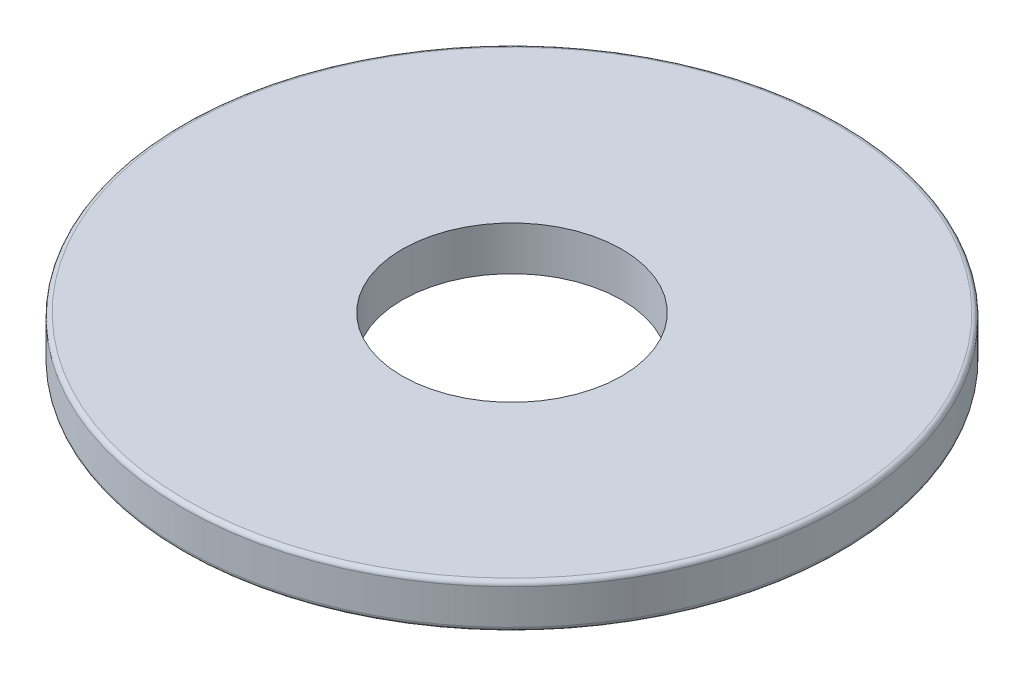
ISO-10303-21;
HEADER;
FILE_DESCRIPTION(('STEP AP214'),'2;1');
FILE_NAME('part.step','',(''),(''),'','','');
FILE_SCHEMA(('AUTOMOTIVE_DESIGN { 1 0 10303 214 1 1 1 1 }'));
ENDSEC;
DATA;
#1=APPLICATION_CONTEXT('core data for automotive mechanical design processes');
#2=APPLICATION_PROTOCOL_DEFINITION('international standard','automotive_design',2000,#1);
#3=PRODUCT_CONTEXT('',#1,'mechanical');
#4=PRODUCT('Part','Part','',(#3));
#5=PRODUCT_RELATED_PRODUCT_CATEGORY('part','',(#4));
#6=PRODUCT_DEFINITION_FORMATION('','',#4);
#7=PRODUCT_DEFINITION_CONTEXT('part definition',#1,'design');
#8=PRODUCT_DEFINITION('design','',#6,#7);
#9=PRODUCT_DEFINITION_SHAPE('','',#8);
#10=(LENGTH_UNIT() NAMED_UNIT(*) SI_UNIT(.MILLI.,.METRE.));
#11=(NAMED_UNIT(*) PLANE_ANGLE_UNIT() SI_UNIT($,.RADIAN.));
#12=(NAMED_UNIT(*) SI_UNIT($,.STERADIAN.) SOLID_ANGLE_UNIT());
#13=UNCERTAINTY_MEASURE_WITH_UNIT(LENGTH_MEASURE(1.E-05),#10,'distance_accuracy_value','');
#14=(GEOMETRIC_REPRESENTATION_CONTEXT(3) GLOBAL_UNCERTAINTY_ASSIGNED_CONTEXT((#13)) GLOBAL_UNIT_ASSIGNED_CONTEXT((#10,
#11,#12)) REPRESENTATION_CONTEXT('',''));
#15=CARTESIAN_POINT('',(0.,0.,0.));
#16=DIRECTION('',(0.,0.,1.));
#17=DIRECTION('',(1.,0.,0.));
#18=AXIS2_PLACEMENT_3D('',#15,#16,#17);
#19=CARTESIAN_POINT('',(0.,2.,0.));
#20=DIRECTION('',(0.,1.,0.));
#21=DIRECTION('',(0.,0.,1.));
#22=AXIS2_PLACEMENT_3D('',#19,#20,#21);
#23=PLANE('',#22);
#24=CARTESIAN_POINT('',(0.,2.,0.));
#25=DIRECTION('',(0.,1.,0.));
#26=DIRECTION('',(0.,0.,1.));
#27=AXIS2_PLACEMENT_3D('',#24,#25,#26);
#28=CIRCLE('',#27,14.8);
#29=CARTESIAN_POINT('',(0.,2.,14.8));
#30=VERTEX_POINT('',#29);
#31=EDGE_CURVE('E10',#30,#30,#28,.T.);
#32=ORIENTED_EDGE('',*,*,#31,.T.);
#33=EDGE_LOOP('',(#32));
#34=FACE_BOUND('',#33,.T.);
#35=CARTESIAN_POINT('',(0.,2.,0.));
#36=DIRECTION('',(0.,1.,0.));
#37=DIRECTION('',(0.,0.,1.));
#38=AXIS2_PLACEMENT_3D('',#35,#36,#37);
#39=CIRCLE('',#38,5.);
#40=CARTESIAN_POINT('',(0.,2.,5.));
#41=VERTEX_POINT('',#40);
#42=EDGE_CURVE('E61',#41,#41,#39,.T.);
#43=ORIENTED_EDGE('',*,*,#42,.F.);
#44=EDGE_LOOP('',(#43));
#45=FACE_BOUND('',#44,.T.);
#46=ADVANCED_FACE('F37',(#34,#45),#23,.T.);
#47=CARTESIAN_POINT('',(0.,0.,0.));
#48=DIRECTION('',(0.,1.,0.));
#49=DIRECTION('',(0.,0.,1.));
#50=AXIS2_PLACEMENT_3D('',#47,#48,#49);
#51=PLANE('',#50);
#52=CARTESIAN_POINT('',(0.,0.,0.));
#53=DIRECTION('',(0.,1.,0.));
#54=DIRECTION('',(0.,0.,1.));
#55=AXIS2_PLACEMENT_3D('',#52,#53,#54);
#56=CIRCLE('',#55,14.8);
#57=CARTESIAN_POINT('',(0.,0.,14.8));
#58=VERTEX_POINT('',#57);
#59=EDGE_CURVE('E45',#58,#58,#56,.F.);
#60=ORIENTED_EDGE('',*,*,#59,.T.);
#61=EDGE_LOOP('',(#60));
#62=FACE_BOUND('',#61,.T.);
#63=CARTESIAN_POINT('',(0.,0.,0.));
#64=DIRECTION('',(0.,1.,0.));
#65=DIRECTION('',(0.,0.,1.));
#66=AXIS2_PLACEMENT_3D('',#63,#64,#65);
#67=CIRCLE('',#66,5.);
#68=CARTESIAN_POINT('',(0.,0.,5.));
#69=VERTEX_POINT('',#68);
#70=EDGE_CURVE('E62',#69,#69,#67,.T.);
#71=ORIENTED_EDGE('',*,*,#70,.T.);
#72=EDGE_LOOP('',(#71));
#73=FACE_BOUND('',#72,.T.);
#74=ADVANCED_FACE('F74',(#62,#73),#51,.F.);
#75=CARTESIAN_POINT('',(0.,2.,0.));
#76=DIRECTION('',(0.,-1.,0.));
#77=DIRECTION('',(0.,0.,-1.));
#78=AXIS2_PLACEMENT_3D('',#75,#76,#77);
#79=CYLINDRICAL_SURFACE('',#78,15.);
#80=CARTESIAN_POINT('',(0.,0.2,0.));
#81=DIRECTION('',(0.,1.,0.));
#82=DIRECTION('',(0.,0.,1.));
#83=AXIS2_PLACEMENT_3D('',#80,#81,#82);
#84=CIRCLE('',#83,15.);
#85=CARTESIAN_POINT('',(0.,0.2,15.));
#86=VERTEX_POINT('',#85);
#87=EDGE_CURVE('E50',#86,#86,#84,.T.);
#88=ORIENTED_EDGE('',*,*,#87,.T.);
#89=EDGE_LOOP('',(#88));
#90=FACE_BOUND('',#89,.T.);
#91=CARTESIAN_POINT('',(0.,1.8,0.));
#92=DIRECTION('',(0.,1.,0.));
#93=DIRECTION('',(0.,0.,1.));
#94=AXIS2_PLACEMENT_3D('',#91,#92,#93);
#95=CIRCLE('',#94,15.);
#96=CARTESIAN_POINT('',(0.,1.8,15.));
#97=VERTEX_POINT('',#96);
#98=EDGE_CURVE('E55',#97,#97,#95,.F.);
#99=ORIENTED_EDGE('',*,*,#98,.T.);
#100=EDGE_LOOP('',(#99));
#101=FACE_BOUND('',#100,.T.);
#102=ADVANCED_FACE('F79',(#90,#101),#79,.T.);
#103=CARTESIAN_POINT('',(0.,2.,0.));
#104=DIRECTION('',(0.,-1.,0.));
#105=DIRECTION('',(0.,0.,-1.));
#106=AXIS2_PLACEMENT_3D('',#103,#104,#105);
#107=CYLINDRICAL_SURFACE('',#106,5.);
#108=ORIENTED_EDGE('',*,*,#42,.T.);
#109=EDGE_LOOP('',(#108));
#110=FACE_BOUND('',#109,.T.);
#111=ORIENTED_EDGE('',*,*,#70,.F.);
#112=EDGE_LOOP('',(#111));
#113=FACE_BOUND('',#112,.T.);
#114=ADVANCED_FACE('F70',(#110,#113),#107,.F.);
#115=CARTESIAN_POINT('',(0.,0.2,0.));
#116=DIRECTION('',(0.,1.,0.));
#117=DIRECTION('',(0.,0.,1.));
#118=AXIS2_PLACEMENT_3D('',#115,#116,#117);
#119=TOROIDAL_SURFACE('',#118,14.8,0.2);
#120=ORIENTED_EDGE('',*,*,#59,.F.);
#121=EDGE_LOOP('',(#120));
#122=FACE_BOUND('',#121,.T.);
#123=ORIENTED_EDGE('',*,*,#87,.F.);
#124=EDGE_LOOP('',(#123));
#125=FACE_BOUND('',#124,.T.);
#126=ADVANCED_FACE('F85',(#122,#125),#119,.T.);
#127=CARTESIAN_POINT('',(0.,1.8,0.));
#128=DIRECTION('',(0.,1.,0.));
#129=DIRECTION('',(0.,0.,1.));
#130=AXIS2_PLACEMENT_3D('',#127,#128,#129);
#131=TOROIDAL_SURFACE('',#130,14.8,0.2);
#132=ORIENTED_EDGE('',*,*,#98,.F.);
#133=EDGE_LOOP('',(#132));
#134=FACE_BOUND('',#133,.T.);
#135=ORIENTED_EDGE('',*,*,#31,.F.);
#136=EDGE_LOOP('',(#135));
#137=FACE_BOUND('',#136,.T.);
#138=ADVANCED_FACE('F39',(#134,#137),#131,.T.);
#139=CLOSED_SHELL('',(#46,#74,#102,#114,#126,#138));
#140=MANIFOLD_SOLID_BREP('B2',#139);
#141=ADVANCED_BREP_SHAPE_REPRESENTATION('',(#18,#140),#14);
#142=SHAPE_DEFINITION_REPRESENTATION(#9,#141);
ENDSEC;
END-ISO-10303-21;
